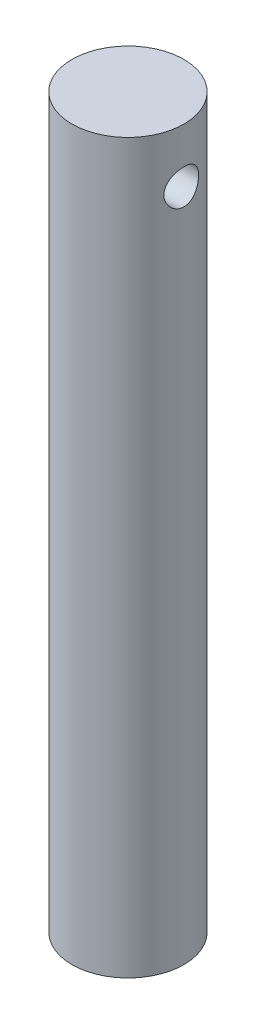
ISO-10303-21;
HEADER;
FILE_DESCRIPTION(('STEP AP214'),'2;1');
FILE_NAME('part.step','',(''),(''),'','','');
FILE_SCHEMA(('AUTOMOTIVE_DESIGN { 1 0 10303 214 1 1 1 1 }'));
ENDSEC;
DATA;
#1=APPLICATION_CONTEXT('core data for automotive mechanical design processes');
#2=APPLICATION_PROTOCOL_DEFINITION('international standard','automotive_design',2000,#1);
#3=PRODUCT_CONTEXT('',#1,'mechanical');
#4=PRODUCT('Part','Part','',(#3));
#5=PRODUCT_RELATED_PRODUCT_CATEGORY('part','',(#4));
#6=PRODUCT_DEFINITION_FORMATION('','',#4);
#7=PRODUCT_DEFINITION_CONTEXT('part definition',#1,'design');
#8=PRODUCT_DEFINITION('design','',#6,#7);
#9=PRODUCT_DEFINITION_SHAPE('','',#8);
#10=(LENGTH_UNIT() NAMED_UNIT(*) SI_UNIT(.MILLI.,.METRE.));
#11=(NAMED_UNIT(*) PLANE_ANGLE_UNIT() SI_UNIT($,.RADIAN.));
#12=(NAMED_UNIT(*) SI_UNIT($,.STERADIAN.) SOLID_ANGLE_UNIT());
#13=UNCERTAINTY_MEASURE_WITH_UNIT(LENGTH_MEASURE(1.E-05),#10,'distance_accuracy_value','');
#14=(GEOMETRIC_REPRESENTATION_CONTEXT(3) GLOBAL_UNCERTAINTY_ASSIGNED_CONTEXT((#13)) GLOBAL_UNIT_ASSIGNED_CONTEXT((#10,
#11,#12)) REPRESENTATION_CONTEXT('',''));
#15=CARTESIAN_POINT('',(0.,0.,0.));
#16=DIRECTION('',(0.,0.,1.));
#17=DIRECTION('',(1.,0.,0.));
#18=AXIS2_PLACEMENT_3D('',#15,#16,#17);
#19=CARTESIAN_POINT('',(0.,130.,0.));
#20=DIRECTION('',(0.,-1.,0.));
#21=DIRECTION('',(0.,0.,-1.));
#22=AXIS2_PLACEMENT_3D('',#19,#20,#21);
#23=CYLINDRICAL_SURFACE('',#22,10.);
#24=CARTESIAN_POINT('',(-10.,117.2,0.));
#25=CARTESIAN_POINT('',(-9.99999902073557,117.200001308529,-0.169796920855891));
#26=CARTESIAN_POINT('',(-9.99563442375018,117.213996508697,-0.33960733668476));
#27=CARTESIAN_POINT('',(-9.97865054414503,117.269463622321,-0.674266441555786));
#28=CARTESIAN_POINT('',(-9.96602927340371,117.310942153511,-0.839113925572721));
#29=CARTESIAN_POINT('',(-9.93391167397765,117.419845824015,-1.15897272927845));
#30=CARTESIAN_POINT('',(-9.91442589027061,117.487231180767,-1.31399870780976));
#31=CARTESIAN_POINT('',(-9.87059390489131,117.645867659729,-1.61055112364306));
#32=CARTESIAN_POINT('',(-9.84624696117201,117.737122426219,-1.75207549506965));
#33=CARTESIAN_POINT('',(-9.79445053429251,117.943832508474,-2.02191665750163));
#34=CARTESIAN_POINT('',(-9.76693426248667,118.059883036359,-2.14976462458015));
#35=CARTESIAN_POINT('',(-9.7122896138575,118.311622809048,-2.38453104148637));
#36=CARTESIAN_POINT('',(-9.68516130863978,118.447315629044,-2.49144567277949));
#37=CARTESIAN_POINT('',(-9.63364954531737,118.738528163891,-2.6838373458767));
#38=CARTESIAN_POINT('',(-9.609348635187,118.894448990408,-2.76873144192814));
#39=CARTESIAN_POINT('',(-9.56724635351237,119.219229360529,-2.91089923867891));
#40=CARTESIAN_POINT('',(-9.54944330109188,119.388085544299,-2.96818008364982));
#41=CARTESIAN_POINT('',(-9.52305054549581,119.728658233597,-3.05178495406996));
#42=CARTESIAN_POINT('',(-9.51420299743532,119.900140979795,-3.07897757392955));
#43=CARTESIAN_POINT('',(-9.50595714202736,120.245445389275,-3.10434744264987));
#44=CARTESIAN_POINT('',(-9.50655636836613,120.419266430247,-3.1025322647109));
#45=CARTESIAN_POINT('',(-9.51690857154057,120.757153161459,-3.07061800700966));
#46=CARTESIAN_POINT('',(-9.52630523759645,120.921335583371,-3.04161982654158));
#47=CARTESIAN_POINT('',(-9.55261520285249,121.242379580255,-2.9579463985126));
#48=CARTESIAN_POINT('',(-9.56952928928698,121.399240386597,-2.9032684616992));
#49=CARTESIAN_POINT('',(-9.60924366073289,121.703825243084,-2.76900342399105));
#50=CARTESIAN_POINT('',(-9.63212534527812,121.851384828965,-2.68906833995309));
#51=CARTESIAN_POINT('',(-9.68115905879403,122.131358804087,-2.50679978007129));
#52=CARTESIAN_POINT('',(-9.70731192513767,122.263769298713,-2.40446056405859));
#53=CARTESIAN_POINT('',(-9.76137382843075,122.515914421625,-2.17487334538022));
#54=CARTESIAN_POINT('',(-9.78930907837817,122.634816523474,-2.04671553741259));
#55=CARTESIAN_POINT('',(-9.84275484470535,122.84964187868,-1.77193162064485));
#56=CARTESIAN_POINT('',(-9.86826518704281,122.945563483413,-1.62530418798238));
#57=CARTESIAN_POINT('',(-9.91424741310582,123.112257094852,-1.31615737091424));
#58=CARTESIAN_POINT('',(-9.93467972030203,123.182833352129,-1.15352615362242));
#59=CARTESIAN_POINT('',(-9.96791813365005,123.295380774073,-0.817919686324546));
#60=CARTESIAN_POINT('',(-9.98072651691769,123.337360480507,-0.644947541952458));
#61=CARTESIAN_POINT('',(-9.99690877528752,123.390111507909,-0.300638148558482));
#62=CARTESIAN_POINT('',(-10.0006232685849,123.402010122918,-0.129489365513017));
#63=CARTESIAN_POINT('',(-9.99920497500666,123.397435801686,0.212376219031713));
#64=CARTESIAN_POINT('',(-9.99407345775425,123.380966936887,0.383093079000966));
#65=CARTESIAN_POINT('',(-9.97576338237303,123.32103149155,0.714919594666447));
#66=CARTESIAN_POINT('',(-9.96278416046779,123.278233236782,0.87616201789108));
#67=CARTESIAN_POINT('',(-9.93029379265401,123.167667073906,1.18913446446706));
#68=CARTESIAN_POINT('',(-9.9107818440301,123.099896097146,1.34086331610716));
#69=CARTESIAN_POINT('',(-9.86664943350378,122.939477998961,1.63457371739726));
#70=CARTESIAN_POINT('',(-9.84191704144451,122.846269958592,1.77623162648862));
#71=CARTESIAN_POINT('',(-9.79017420669188,122.638298268432,2.04227505065868));
#72=CARTESIAN_POINT('',(-9.76316315660666,122.523528861245,2.16665593689704));
#73=CARTESIAN_POINT('',(-9.70858418694528,122.270391102464,2.39964211637346));
#74=CARTESIAN_POINT('',(-9.68103555865981,122.131277662171,2.50744420520635));
#75=CARTESIAN_POINT('',(-9.6296046302432,121.836336404476,2.69824263692461));
#76=CARTESIAN_POINT('',(-9.60572226345288,121.680508891052,2.78123943084052));
#77=CARTESIAN_POINT('',(-9.56459521120936,121.356922724196,2.91954365006883));
#78=CARTESIAN_POINT('',(-9.54732372869111,121.189215575163,2.97496313967632));
#79=CARTESIAN_POINT('',(-9.52151044789343,120.846206627468,3.05658418408721));
#80=CARTESIAN_POINT('',(-9.51296539600616,120.670907684801,3.0827966289295));
#81=CARTESIAN_POINT('',(-9.50590778775765,120.326077086306,3.10448580741132));
#82=CARTESIAN_POINT('',(-9.50696567365777,120.156635956976,3.101278474176));
#83=CARTESIAN_POINT('',(-9.51795340966393,119.820832014513,3.06738863255874));
#84=CARTESIAN_POINT('',(-9.52788285816744,119.654469062383,3.03670736788091));
#85=CARTESIAN_POINT('',(-9.55519716100731,119.331855936754,2.9496152327447));
#86=CARTESIAN_POINT('',(-9.57247435099067,119.175495849811,2.8935752059032));
#87=CARTESIAN_POINT('',(-9.61251146789651,118.874272618373,2.75764759447982));
#88=CARTESIAN_POINT('',(-9.63527249700809,118.72941179289,2.67775521507416));
#89=CARTESIAN_POINT('',(-9.68480840625829,118.449249975722,2.49278489522552));
#90=CARTESIAN_POINT('',(-9.71170426580514,118.314533442518,2.38685418432441));
#91=CARTESIAN_POINT('',(-9.76591677924898,118.064362247979,2.15432170013904));
#92=CARTESIAN_POINT('',(-9.79323354324163,117.948912723039,2.02771443242891));
#93=CARTESIAN_POINT('',(-9.84625677988313,117.736863845012,1.75255504376495));
#94=CARTESIAN_POINT('',(-9.87188392696447,117.640984541507,1.60343105987635));
#95=CARTESIAN_POINT('',(-9.91765415246241,117.475784899995,1.29038694828325));
#96=CARTESIAN_POINT('',(-9.93779947004383,117.406453713144,1.12647289842431));
#97=CARTESIAN_POINT('',(-9.9688595003439,117.301594655031,0.803593103212455));
#98=CARTESIAN_POINT('',(-9.98043679382465,117.263605073187,0.645488020512695));
#99=CARTESIAN_POINT('',(-9.99600677336268,117.212809572707,0.32492550753877));
#100=CARTESIAN_POINT('',(-10.0000009370019,117.199998747943,0.162468931415852));
#101=CARTESIAN_POINT('',(-10.,117.2,0.));
#102=B_SPLINE_CURVE_WITH_KNOTS('',3,(#24,#25,#26,#27,#28,#29,#30,#31,#32,#33,#34,#35,#36,#37,
#38,#39,#40,#41,#42,#43,#44,#45,#46,#47,#48,#49,#50,#51,#52,#53,#54,#55,#56,#57,#58,#59,#60,#61,
#62,#63,#64,#65,#66,#67,#68,#69,#70,#71,#72,#73,#74,#75,#76,#77,#78,#79,#80,#81,#82,#83,#84,#85,
#86,#87,#88,#89,#90,#91,#92,#93,#94,#95,#96,#97,#98,#99,#100,#101),.UNSPECIFIED.,.T.,.F.,(4,2,2,
2,2,2,2,2,2,2,2,2,2,2,2,2,2,2,2,2,2,2,2,2,2,2,2,2,2,2,2,2,2,2,2,2,2,2,4),(0.,0.508793660386023,
1.01770987813483,1.52584770479442,2.03406315713353,2.55622032523605,3.07847265358455,
3.61339375403706,4.14817638200766,4.66708171587238,5.18585157892854,5.68447946031444,
6.18315957098777,6.68903412267704,7.19503843662964,7.72368894251592,8.25237736250052,
8.78506537400784,9.31759420216289,9.8298490296871,10.3420303419877,10.8417185459025,
11.3414681720557,11.8532794790429,12.3652276465345,12.8971171300694,13.4289969417581,
13.958697364449,14.4882002186917,14.9941383098298,15.5000534990589,15.998798069905,
16.4976429664659,17.0157339453742,17.5339628223973,18.0687478361599,18.6033140770696,
19.0902444272055,19.5770798886343),.UNSPECIFIED.);
#103=CARTESIAN_POINT('',(-10.,117.2,0.));
#104=VERTEX_POINT('',#103);
#105=EDGE_CURVE('E10',#104,#104,#102,.T.);
#106=ORIENTED_EDGE('',*,*,#105,.T.);
#107=EDGE_LOOP('',(#106));
#108=FACE_BOUND('',#107,.T.);
#109=CARTESIAN_POINT('',(9.50736556570746,120.3,-3.09999999999999));
#110=CARTESIAN_POINT('',(9.50736676636624,120.130424451485,-3.09999864890097));
#111=CARTESIAN_POINT('',(9.51195208830857,119.960835363877,-3.08603861369874));
#112=CARTESIAN_POINT('',(9.52971845612583,119.626634564874,-3.03072383584299));
#113=CARTESIAN_POINT('',(9.54290193468915,119.462024275934,-2.98936134012092));
#114=CARTESIAN_POINT('',(9.57623105585536,119.142669668016,-2.88079656231542));
#115=CARTESIAN_POINT('',(9.59636452373633,118.987908653252,-2.81363944322435));
#116=CARTESIAN_POINT('',(9.64130826344982,118.691808094175,-2.65554200648056));
#117=CARTESIAN_POINT('',(9.66611933617294,118.550470854496,-2.56459761498185));
#118=CARTESIAN_POINT('',(9.71856332456026,118.280452416982,-2.3582152784556));
#119=CARTESIAN_POINT('',(9.74625941519737,118.152291796797,-2.24211213476881));
#120=CARTESIAN_POINT('',(9.80081480803842,117.916912390624,-1.99013186884194));
#121=CARTESIAN_POINT('',(9.82767399490095,117.809696480583,-1.85425203550081));
#122=CARTESIAN_POINT('',(9.87825089481637,117.616960214455,-1.56284223211642));
#123=CARTESIAN_POINT('',(9.90188553940508,117.531974892144,-1.4069427119225));
#124=CARTESIAN_POINT('',(9.94261339925288,117.389632896433,-1.08220611895481));
#125=CARTESIAN_POINT('',(9.95970812599949,117.332269838258,-0.913372046418461));
#126=CARTESIAN_POINT('',(9.98498290620197,117.248535738729,-0.573008728898473));
#127=CARTESIAN_POINT('',(9.99341827405358,117.221275180443,-0.401717622303926));
#128=CARTESIAN_POINT('',(10.0013250976492,117.195702702906,-0.0567990203013616));
#129=CARTESIAN_POINT('',(10.0007985595664,117.19738430479,0.116827943516286));
#130=CARTESIAN_POINT('',(9.99101922016058,117.22906083628,0.455233184487504));
#131=CARTESIAN_POINT('',(9.98206355851276,117.258091694251,0.620111658831158));
#132=CARTESIAN_POINT('',(9.95679681576947,117.342062222645,0.942529368401111));
#133=CARTESIAN_POINT('',(9.94048525759759,117.397003573538,1.10006812686914));
#134=CARTESIAN_POINT('',(9.90193821347155,117.531861670315,1.40557246813734));
#135=CARTESIAN_POINT('',(9.87963330635494,117.612073129668,1.55339883589297));
#136=CARTESIAN_POINT('',(9.83145285138935,117.794958787661,1.83379506171618));
#137=CARTESIAN_POINT('',(9.80557641228811,117.897638596885,1.96636109647695));
#138=CARTESIAN_POINT('',(9.75175679512367,118.127506160215,2.2182232435643));
#139=CARTESIAN_POINT('',(9.72377238141297,118.255526809349,2.33675143365646));
#140=CARTESIAN_POINT('',(9.66980979728555,118.529891992971,2.55088299282151));
#141=CARTESIAN_POINT('',(9.64383185563169,118.676238611878,2.64648375048882));
#142=CARTESIAN_POINT('',(9.59661771882305,118.985241088813,2.81292114020214));
#143=CARTESIAN_POINT('',(9.57543601886212,119.148056646705,2.88347788248684));
#144=CARTESIAN_POINT('',(9.54085330949264,119.484071982509,2.99593384704185));
#145=CARTESIAN_POINT('',(9.52744955757276,119.65726807644,3.03784317134582));
#146=CARTESIAN_POINT('',(9.51054773693132,120.001780629371,3.09034251748382));
#147=CARTESIAN_POINT('',(9.50667852853345,120.172900064779,3.10210672710079));
#148=CARTESIAN_POINT('',(9.50825428642433,120.514678250575,3.0972746970036));
#149=CARTESIAN_POINT('',(9.51369784148448,120.685337066838,3.08068275429717));
#150=CARTESIAN_POINT('',(9.53291978853358,121.016326656154,3.02065803531269));
#151=CARTESIAN_POINT('',(9.54645785779539,121.176813040616,2.9779984230715));
#152=CARTESIAN_POINT('',(9.5800899524026,121.488333712537,2.86795478334852));
#153=CARTESIAN_POINT('',(9.60018503562314,121.639366470106,2.80056676609347));
#154=CARTESIAN_POINT('',(9.64537341241102,121.932423894336,2.64080106837511));
#155=CARTESIAN_POINT('',(9.67059210343362,122.074072480136,2.54776992017527));
#156=CARTESIAN_POINT('',(9.72292459768052,122.34017581435,2.34012430484113));
#157=CARTESIAN_POINT('',(9.75003888426889,122.464626153069,2.22550431998355));
#158=CARTESIAN_POINT('',(9.80444240119515,122.698022267186,1.97238630338187));
#159=CARTESIAN_POINT('',(9.83169386622825,122.806131222351,1.83310650986773));
#160=CARTESIAN_POINT('',(9.88219703725532,122.997472773805,1.53772505697807));
#161=CARTESIAN_POINT('',(9.90544893003413,123.08070653193,1.3816241837213));
#162=CARTESIAN_POINT('',(9.94519819292712,123.219134796939,1.05800912996466));
#163=CARTESIAN_POINT('',(9.96174467138601,123.274533901468,0.890588809191825));
#164=CARTESIAN_POINT('',(9.98643498855168,123.356209976892,0.548205229960643));
#165=CARTESIAN_POINT('',(9.99458141058493,123.382495901347,0.373244307769602));
#166=CARTESIAN_POINT('',(10.0013853824155,123.404481467186,0.0284551538653225));
#167=CARTESIAN_POINT('',(10.0004182354368,123.401390809977,-0.141289457313179));
#168=CARTESIAN_POINT('',(9.98999976757163,123.367629528331,-0.47773240501306));
#169=CARTESIAN_POINT('',(9.98054898490547,123.336960653516,-0.644430934099939));
#170=CARTESIAN_POINT('',(9.95434153847421,123.249679545579,-0.96806496431769));
#171=CARTESIAN_POINT('',(9.93767494532364,123.193386729419,-1.12509440878578));
#172=CARTESIAN_POINT('',(9.89875549252942,123.05674357942,-1.42755666362607));
#173=CARTESIAN_POINT('',(9.87650168236303,122.976389151662,-1.57298749523681));
#174=CARTESIAN_POINT('',(9.82780452302839,122.790785188478,-1.85343048190946));
#175=CARTESIAN_POINT('',(9.80124569242192,122.684791076567,-1.98792960743175));
#176=CARTESIAN_POINT('',(9.74727365130231,122.45223531961,-2.23763443627725));
#177=CARTESIAN_POINT('',(9.71986018907547,122.325667567885,-2.35283439053033));
#178=CARTESIAN_POINT('',(9.666228451726,122.050633439684,-2.56443933819457));
#179=CARTESIAN_POINT('',(9.64007782242423,121.901589749445,-2.66011316854784));
#180=CARTESIAN_POINT('',(9.59307344394776,121.588757570713,-2.82494766900961));
#181=CARTESIAN_POINT('',(9.57221747022905,121.42497531392,-2.89411948015453));
#182=CARTESIAN_POINT('',(9.5399451366621,121.102454876488,-2.9986952612416));
#183=CARTESIAN_POINT('',(9.52784912196116,120.944585173519,-3.03657438236824));
#184=CARTESIAN_POINT('',(9.51155969647857,120.624480417384,-3.08722442937451));
#185=CARTESIAN_POINT('',(9.50736441694178,120.462246405717,-3.10000129270382));
#186=CARTESIAN_POINT('',(9.50736556570746,120.3,-3.09999999999999));
#187=B_SPLINE_CURVE_WITH_KNOTS('',3,(#109,#110,#111,#112,#113,#114,#115,#116,#117,#118,#119,
#120,#121,#122,#123,#124,#125,#126,#127,#128,#129,#130,#131,#132,#133,#134,#135,#136,#137,#138,
#139,#140,#141,#142,#143,#144,#145,#146,#147,#148,#149,#150,#151,#152,#153,#154,#155,#156,#157,
#158,#159,#160,#161,#162,#163,#164,#165,#166,#167,#168,#169,#170,#171,#172,#173,#174,#175,#176,
#177,#178,#179,#180,#181,#182,#183,#184,#185,#186),.UNSPECIFIED.,.T.,.F.,(4,2,2,2,2,2,2,2,2,2,2,
2,2,2,2,2,2,2,2,2,2,2,2,2,2,2,2,2,2,2,2,2,2,2,2,2,2,2,4),(0.,0.508127484507291,1.01639879663347,
1.52378421957178,2.03125659510417,2.55428048966279,3.07737615095992,3.61209545309211,
4.14669109762863,4.665027798743,5.18324846878217,5.68385921453385,6.18450243272814,
6.69121518852716,7.19805462054025,7.72569570997919,8.25339686855991,8.78682249617939,
9.32005992298395,9.83218754771351,10.3442375730134,10.8417914192468,11.3394255779988,
11.8511482041754,12.3630017954766,12.8956805147701,13.4283343505677,13.9570134573076,
14.4855299272299,14.9923800021415,15.4991979236582,15.9998641271725,16.5006155640799,
17.018161891184,17.5358621181427,18.0703609437858,18.6046348272529,19.0909158135559,
19.5770817657183),.UNSPECIFIED.);
#188=CARTESIAN_POINT('',(9.50736556570746,120.3,-3.09999999999999));
#189=VERTEX_POINT('',#188);
#190=EDGE_CURVE('E42',#189,#189,#187,.T.);
#191=ORIENTED_EDGE('',*,*,#190,.T.);
#192=EDGE_LOOP('',(#191));
#193=FACE_BOUND('',#192,.T.);
#194=CARTESIAN_POINT('',(0.,130.,0.));
#195=DIRECTION('',(0.,1.,0.));
#196=DIRECTION('',(0.,0.,1.));
#197=AXIS2_PLACEMENT_3D('',#194,#195,#196);
#198=CIRCLE('',#197,10.);
#199=CARTESIAN_POINT('',(0.,130.,10.));
#200=VERTEX_POINT('',#199);
#201=EDGE_CURVE('E46',#200,#200,#198,.T.);
#202=ORIENTED_EDGE('',*,*,#201,.F.);
#203=EDGE_LOOP('',(#202));
#204=FACE_BOUND('',#203,.T.);
#205=CARTESIAN_POINT('',(0.,0.,0.));
#206=DIRECTION('',(0.,1.,0.));
#207=DIRECTION('',(0.,0.,1.));
#208=AXIS2_PLACEMENT_3D('',#205,#206,#207);
#209=CIRCLE('',#208,10.);
#210=CARTESIAN_POINT('',(0.,0.,10.));
#211=VERTEX_POINT('',#210);
#212=EDGE_CURVE('E50',#211,#211,#209,.T.);
#213=ORIENTED_EDGE('',*,*,#212,.T.);
#214=EDGE_LOOP('',(#213));
#215=FACE_BOUND('',#214,.T.);
#216=ADVANCED_FACE('F32',(#108,#193,#204,#215),#23,.T.);
#217=CARTESIAN_POINT('',(0.,130.,0.));
#218=DIRECTION('',(0.,1.,0.));
#219=DIRECTION('',(0.,0.,1.));
#220=AXIS2_PLACEMENT_3D('',#217,#218,#219);
#221=PLANE('',#220);
#222=ORIENTED_EDGE('',*,*,#201,.T.);
#223=EDGE_LOOP('',(#222));
#224=FACE_BOUND('',#223,.T.);
#225=ADVANCED_FACE('F61',(#224),#221,.T.);
#226=CARTESIAN_POINT('',(0.,0.,0.));
#227=DIRECTION('',(0.,1.,0.));
#228=DIRECTION('',(0.,0.,1.));
#229=AXIS2_PLACEMENT_3D('',#226,#227,#228);
#230=PLANE('',#229);
#231=ORIENTED_EDGE('',*,*,#212,.F.);
#232=EDGE_LOOP('',(#231));
#233=FACE_BOUND('',#232,.T.);
#234=ADVANCED_FACE('F59',(#233),#230,.F.);
#235=CARTESIAN_POINT('',(10.,120.3,0.));
#236=DIRECTION('',(1.,0.,0.));
#237=DIRECTION('',(0.,0.,-1.));
#238=AXIS2_PLACEMENT_3D('',#235,#236,#237);
#239=CYLINDRICAL_SURFACE('',#238,3.09999999999999);
#240=ORIENTED_EDGE('',*,*,#190,.F.);
#241=EDGE_LOOP('',(#240));
#242=FACE_BOUND('',#241,.T.);
#243=ORIENTED_EDGE('',*,*,#105,.F.);
#244=EDGE_LOOP('',(#243));
#245=FACE_BOUND('',#244,.T.);
#246=ADVANCED_FACE('F55',(#242,#245),#239,.F.);
#247=CLOSED_SHELL('',(#216,#225,#234,#246));
#248=MANIFOLD_SOLID_BREP('B2',#247);
#249=ADVANCED_BREP_SHAPE_REPRESENTATION('',(#18,#248),#14);
#250=SHAPE_DEFINITION_REPRESENTATION(#9,#249);
ENDSEC;
END-ISO-10303-21;
